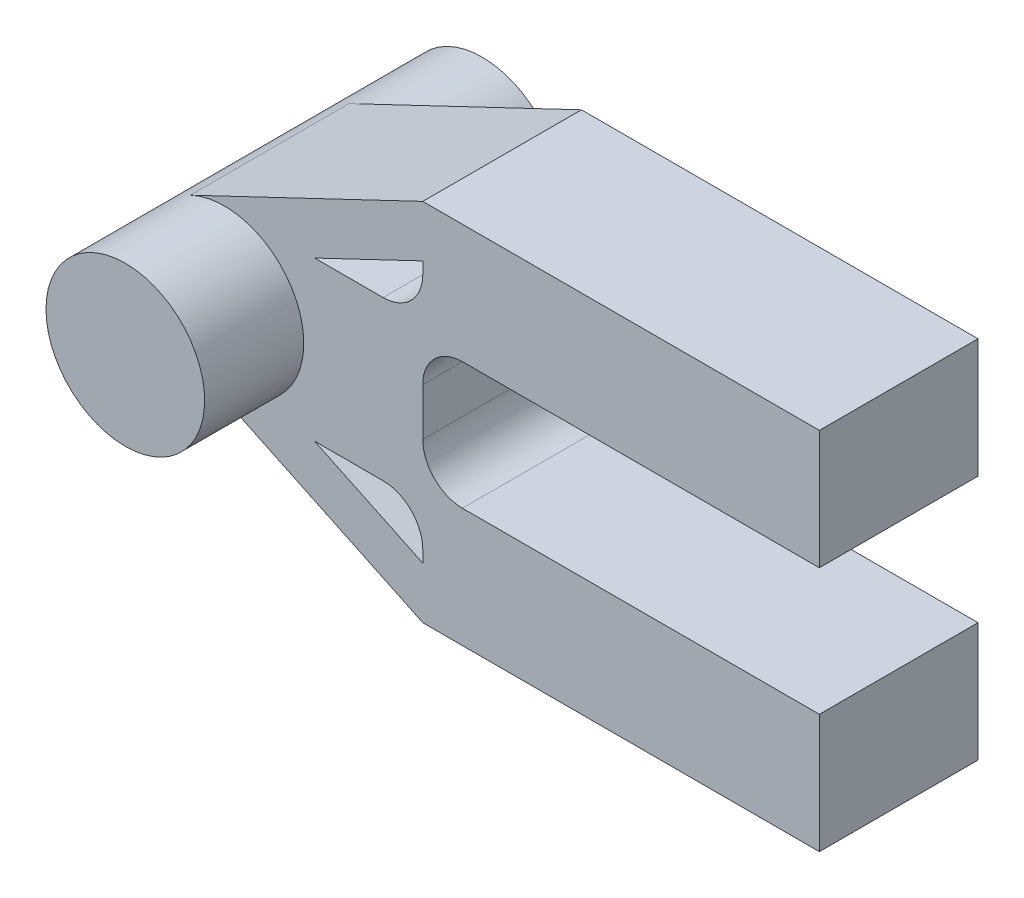
ISO-10303-21;
HEADER;
FILE_DESCRIPTION(('STEP AP214'),'2;1');
FILE_NAME('part.step','',(''),(''),'','','');
FILE_SCHEMA(('AUTOMOTIVE_DESIGN { 1 0 10303 214 1 1 1 1 }'));
ENDSEC;
DATA;
#1=APPLICATION_CONTEXT('core data for automotive mechanical design processes');
#2=APPLICATION_PROTOCOL_DEFINITION('international standard','automotive_design',2000,#1);
#3=PRODUCT_CONTEXT('',#1,'mechanical');
#4=PRODUCT('Part','Part','',(#3));
#5=PRODUCT_RELATED_PRODUCT_CATEGORY('part','',(#4));
#6=PRODUCT_DEFINITION_FORMATION('','',#4);
#7=PRODUCT_DEFINITION_CONTEXT('part definition',#1,'design');
#8=PRODUCT_DEFINITION('design','',#6,#7);
#9=PRODUCT_DEFINITION_SHAPE('','',#8);
#10=(LENGTH_UNIT() NAMED_UNIT(*) SI_UNIT(.MILLI.,.METRE.));
#11=(NAMED_UNIT(*) PLANE_ANGLE_UNIT() SI_UNIT($,.RADIAN.));
#12=(NAMED_UNIT(*) SI_UNIT($,.STERADIAN.) SOLID_ANGLE_UNIT());
#13=UNCERTAINTY_MEASURE_WITH_UNIT(LENGTH_MEASURE(1.E-05),#10,'distance_accuracy_value','');
#14=(GEOMETRIC_REPRESENTATION_CONTEXT(3) GLOBAL_UNCERTAINTY_ASSIGNED_CONTEXT((#13)) GLOBAL_UNIT_ASSIGNED_CONTEXT((#10,
#11,#12)) REPRESENTATION_CONTEXT('',''));
#15=CARTESIAN_POINT('',(0.,0.,0.));
#16=DIRECTION('',(0.,0.,1.));
#17=DIRECTION('',(1.,0.,0.));
#18=AXIS2_PLACEMENT_3D('',#15,#16,#17);
#19=CARTESIAN_POINT('',(0.,0.,0.));
#20=DIRECTION('',(0.,0.,1.));
#21=DIRECTION('',(1.,0.,0.));
#22=AXIS2_PLACEMENT_3D('',#19,#20,#21);
#23=PLANE('',#22);
#24=DIRECTION('',(0.90262924959913,0.4304189096312,0.));
#25=VECTOR('',#24,1.);
#26=CARTESIAN_POINT('',(18.6538539775263,18.0525849919826,0.));
#27=LINE('',#26,#25);
#28=CARTESIAN_POINT('',(22.7377678298497,20.,0.));
#29=VERTEX_POINT('',#28);
#30=CARTESIAN_POINT('',(50.,33.,0.));
#31=VERTEX_POINT('',#30);
#32=EDGE_CURVE('E205',#29,#31,#27,.T.);
#33=ORIENTED_EDGE('',*,*,#32,.F.);
#34=DIRECTION('',(-1.,0.,0.));
#35=VECTOR('',#34,1.);
#36=CARTESIAN_POINT('',(50.,20.,0.));
#37=LINE('',#36,#35);
#38=CARTESIAN_POINT('',(40.,20.,0.));
#39=VERTEX_POINT('',#38);
#40=EDGE_CURVE('E317',#39,#29,#37,.T.);
#41=ORIENTED_EDGE('',*,*,#40,.F.);
#42=CARTESIAN_POINT('',(40.,30.,0.));
#43=DIRECTION('',(0.,0.,1.));
#44=DIRECTION('',(1.,0.,0.));
#45=AXIS2_PLACEMENT_3D('',#42,#43,#44);
#46=CIRCLE('',#45,10.);
#47=CARTESIAN_POINT('',(50.,30.,0.));
#48=VERTEX_POINT('',#47);
#49=EDGE_CURVE('E11',#39,#48,#46,.T.);
#50=ORIENTED_EDGE('',*,*,#49,.T.);
#51=DIRECTION('',(0.,1.,0.));
#52=VECTOR('',#51,1.);
#53=CARTESIAN_POINT('',(50.,16.,0.));
#54=LINE('',#53,#52);
#55=EDGE_CURVE('E223',#48,#31,#54,.T.);
#56=ORIENTED_EDGE('',*,*,#55,.T.);
#57=EDGE_LOOP('',(#33,#41,#50,#56));
#58=FACE_BOUND('',#57,.T.);
#59=DIRECTION('',(0.,1.,0.));
#60=VECTOR('',#59,1.);
#61=CARTESIAN_POINT('',(50.,-46.,0.));
#62=LINE('',#61,#60);
#63=CARTESIAN_POINT('',(50.,-33.,0.));
#64=VERTEX_POINT('',#63);
#65=CARTESIAN_POINT('',(50.,-30.,0.));
#66=VERTEX_POINT('',#65);
#67=EDGE_CURVE('E255',#64,#66,#62,.T.);
#68=ORIENTED_EDGE('',*,*,#67,.T.);
#69=CARTESIAN_POINT('',(40.,-30.,0.));
#70=DIRECTION('',(0.,0.,1.));
#71=DIRECTION('',(1.,0.,0.));
#72=AXIS2_PLACEMENT_3D('',#69,#70,#71);
#73=CIRCLE('',#72,10.);
#74=CARTESIAN_POINT('',(40.,-20.,0.));
#75=VERTEX_POINT('',#74);
#76=EDGE_CURVE('E353',#66,#75,#73,.T.);
#77=ORIENTED_EDGE('',*,*,#76,.T.);
#78=DIRECTION('',(-1.,0.,0.));
#79=VECTOR('',#78,1.);
#80=CARTESIAN_POINT('',(50.,-20.,0.));
#81=LINE('',#80,#79);
#82=CARTESIAN_POINT('',(22.7377678298497,-20.,0.));
#83=VERTEX_POINT('',#82);
#84=EDGE_CURVE('E308',#75,#83,#81,.T.);
#85=ORIENTED_EDGE('',*,*,#84,.T.);
#86=DIRECTION('',(-0.90262924959913,0.4304189096312,0.));
#87=VECTOR('',#86,1.);
#88=CARTESIAN_POINT('',(18.6538539775263,-18.0525849919826,0.));
#89=LINE('',#88,#87);
#90=EDGE_CURVE('E385',#64,#83,#89,.T.);
#91=ORIENTED_EDGE('',*,*,#90,.F.);
#92=EDGE_LOOP('',(#68,#77,#85,#91));
#93=FACE_BOUND('',#92,.T.);
#94=CARTESIAN_POINT('',(0.,0.,0.));
#95=DIRECTION('',(0.,0.,-1.));
#96=DIRECTION('',(-1.,0.,0.));
#97=AXIS2_PLACEMENT_3D('',#94,#95,#96);
#98=CIRCLE('',#97,20.);
#99=CARTESIAN_POINT('',(-8.608378192624,18.0525849919826,0.));
#100=VERTEX_POINT('',#99);
#101=CARTESIAN_POINT('',(-8.60837819262399,-18.0525849919826,0.));
#102=VERTEX_POINT('',#101);
#103=EDGE_CURVE('E175',#100,#102,#98,.T.);
#104=ORIENTED_EDGE('',*,*,#103,.F.);
#105=DIRECTION('',(-0.90262924959913,-0.4304189096312,0.));
#106=VECTOR('',#105,1.);
#107=CARTESIAN_POINT('',(50.,46.,0.));
#108=LINE('',#107,#106);
#109=CARTESIAN_POINT('',(50.,46.,0.));
#110=VERTEX_POINT('',#109);
#111=EDGE_CURVE('E179',#110,#100,#108,.T.);
#112=ORIENTED_EDGE('',*,*,#111,.F.);
#113=DIRECTION('',(1.,0.,0.));
#114=VECTOR('',#113,1.);
#115=CARTESIAN_POINT('',(50.,46.,0.));
#116=LINE('',#115,#114);
#117=CARTESIAN_POINT('',(150.,46.,0.));
#118=VERTEX_POINT('',#117);
#119=EDGE_CURVE('E242',#110,#118,#116,.T.);
#120=ORIENTED_EDGE('',*,*,#119,.T.);
#121=DIRECTION('',(0.,-1.,0.));
#122=VECTOR('',#121,1.);
#123=CARTESIAN_POINT('',(150.,16.,0.));
#124=LINE('',#123,#122);
#125=CARTESIAN_POINT('',(150.,16.,0.));
#126=VERTEX_POINT('',#125);
#127=EDGE_CURVE('E245',#118,#126,#124,.T.);
#128=ORIENTED_EDGE('',*,*,#127,.T.);
#129=DIRECTION('',(-1.,0.,0.));
#130=VECTOR('',#129,1.);
#131=CARTESIAN_POINT('',(50.,16.,0.));
#132=LINE('',#131,#130);
#133=CARTESIAN_POINT('',(60.,16.,0.));
#134=VERTEX_POINT('',#133);
#135=EDGE_CURVE('E228',#126,#134,#132,.T.);
#136=ORIENTED_EDGE('',*,*,#135,.T.);
#137=CARTESIAN_POINT('',(60.,6.,0.));
#138=DIRECTION('',(0.,0.,1.));
#139=DIRECTION('',(1.,0.,0.));
#140=AXIS2_PLACEMENT_3D('',#137,#138,#139);
#141=CIRCLE('',#140,10.);
#142=CARTESIAN_POINT('',(50.,6.,0.));
#143=VERTEX_POINT('',#142);
#144=EDGE_CURVE('E365',#134,#143,#141,.T.);
#145=ORIENTED_EDGE('',*,*,#144,.T.);
#146=DIRECTION('',(0.,1.,0.));
#147=VECTOR('',#146,1.);
#148=CARTESIAN_POINT('',(50.,20.,0.));
#149=LINE('',#148,#147);
#150=CARTESIAN_POINT('',(50.,-5.99999999999999,0.));
#151=VERTEX_POINT('',#150);
#152=EDGE_CURVE('E294',#151,#143,#149,.T.);
#153=ORIENTED_EDGE('',*,*,#152,.F.);
#154=CARTESIAN_POINT('',(60.,-5.99999999999999,0.));
#155=DIRECTION('',(0.,0.,1.));
#156=DIRECTION('',(1.,0.,0.));
#157=AXIS2_PLACEMENT_3D('',#154,#155,#156);
#158=CIRCLE('',#157,10.);
#159=CARTESIAN_POINT('',(60.,-16.,0.));
#160=VERTEX_POINT('',#159);
#161=EDGE_CURVE('E359',#151,#160,#158,.T.);
#162=ORIENTED_EDGE('',*,*,#161,.T.);
#163=DIRECTION('',(1.,0.,0.));
#164=VECTOR('',#163,1.);
#165=CARTESIAN_POINT('',(50.,-16.,0.));
#166=LINE('',#165,#164);
#167=CARTESIAN_POINT('',(150.,-16.,0.));
#168=VERTEX_POINT('',#167);
#169=EDGE_CURVE('E281',#160,#168,#166,.T.);
#170=ORIENTED_EDGE('',*,*,#169,.T.);
#171=DIRECTION('',(0.,-1.,0.));
#172=VECTOR('',#171,1.);
#173=CARTESIAN_POINT('',(150.,-46.,0.));
#174=LINE('',#173,#172);
#175=CARTESIAN_POINT('',(150.,-46.,0.));
#176=VERTEX_POINT('',#175);
#177=EDGE_CURVE('E284',#168,#176,#174,.T.);
#178=ORIENTED_EDGE('',*,*,#177,.T.);
#179=DIRECTION('',(-1.,0.,0.));
#180=VECTOR('',#179,1.);
#181=CARTESIAN_POINT('',(50.,-46.,0.));
#182=LINE('',#181,#180);
#183=CARTESIAN_POINT('',(50.,-46.,0.));
#184=VERTEX_POINT('',#183);
#185=EDGE_CURVE('E266',#176,#184,#182,.T.);
#186=ORIENTED_EDGE('',*,*,#185,.T.);
#187=DIRECTION('',(0.90262924959913,-0.4304189096312,0.));
#188=VECTOR('',#187,1.);
#189=CARTESIAN_POINT('',(-8.60837819262399,-18.0525849919826,0.));
#190=LINE('',#189,#188);
#191=EDGE_CURVE('E181',#102,#184,#190,.T.);
#192=ORIENTED_EDGE('',*,*,#191,.F.);
#193=EDGE_LOOP('',(#104,#112,#120,#128,#136,#145,#153,#162,#170,#178,#186,#192));
#194=FACE_BOUND('',#193,.T.);
#195=ADVANCED_FACE('F39',(#58,#93,#194),#23,.F.);
#196=CARTESIAN_POINT('',(0.,0.,65.));
#197=DIRECTION('',(0.,0.,-1.));
#198=DIRECTION('',(-1.,0.,0.));
#199=AXIS2_PLACEMENT_3D('',#196,#197,#198);
#200=CYLINDRICAL_SURFACE('',#199,20.);
#201=CARTESIAN_POINT('',(0.,0.,65.));
#202=DIRECTION('',(0.,0.,1.));
#203=DIRECTION('',(1.,0.,0.));
#204=AXIS2_PLACEMENT_3D('',#201,#202,#203);
#205=CIRCLE('',#204,20.);
#206=CARTESIAN_POINT('',(20.,0.,65.));
#207=VERTEX_POINT('',#206);
#208=EDGE_CURVE('E320',#207,#207,#205,.T.);
#209=ORIENTED_EDGE('',*,*,#208,.F.);
#210=EDGE_LOOP('',(#209));
#211=FACE_BOUND('',#210,.T.);
#212=DIRECTION('',(0.,0.,-1.));
#213=VECTOR('',#212,1.);
#214=CARTESIAN_POINT('',(-8.60837819262399,-18.0525849919826,40.));
#215=LINE('',#214,#213);
#216=CARTESIAN_POINT('',(-8.60837819262399,-18.0525849919826,40.));
#217=VERTEX_POINT('',#216);
#218=EDGE_CURVE('E378',#217,#102,#215,.T.);
#219=ORIENTED_EDGE('',*,*,#218,.F.);
#220=CARTESIAN_POINT('',(0.,0.,40.));
#221=DIRECTION('',(0.,0.,-1.));
#222=DIRECTION('',(-1.,0.,0.));
#223=AXIS2_PLACEMENT_3D('',#220,#221,#222);
#224=CIRCLE('',#223,20.);
#225=CARTESIAN_POINT('',(-8.608378192624,18.0525849919826,40.));
#226=VERTEX_POINT('',#225);
#227=EDGE_CURVE('E192',#226,#217,#224,.T.);
#228=ORIENTED_EDGE('',*,*,#227,.F.);
#229=DIRECTION('',(0.,0.,-1.));
#230=VECTOR('',#229,1.);
#231=CARTESIAN_POINT('',(-8.60837819262401,18.0525849919826,40.));
#232=LINE('',#231,#230);
#233=EDGE_CURVE('E189',#226,#100,#232,.T.);
#234=ORIENTED_EDGE('',*,*,#233,.T.);
#235=ORIENTED_EDGE('',*,*,#103,.T.);
#236=EDGE_LOOP('',(#219,#228,#234,#235));
#237=FACE_BOUND('',#236,.T.);
#238=CARTESIAN_POINT('',(0.,0.,-25.));
#239=DIRECTION('',(0.,0.,-1.));
#240=DIRECTION('',(-1.,0.,0.));
#241=AXIS2_PLACEMENT_3D('',#238,#239,#240);
#242=CIRCLE('',#241,20.);
#243=CARTESIAN_POINT('',(-20.,0.,-25.));
#244=VERTEX_POINT('',#243);
#245=EDGE_CURVE('E186',#244,#244,#242,.T.);
#246=ORIENTED_EDGE('',*,*,#245,.F.);
#247=EDGE_LOOP('',(#246));
#248=FACE_BOUND('',#247,.T.);
#249=ADVANCED_FACE('F190',(#211,#237,#248),#200,.T.);
#250=CARTESIAN_POINT('',(50.,-20.,0.));
#251=DIRECTION('',(0.,1.,0.));
#252=DIRECTION('',(0.,0.,1.));
#253=AXIS2_PLACEMENT_3D('',#250,#251,#252);
#254=PLANE('',#253);
#255=ORIENTED_EDGE('',*,*,#84,.F.);
#256=DIRECTION('',(0.,0.,-1.));
#257=VECTOR('',#256,1.);
#258=CARTESIAN_POINT('',(40.,-20.,0.));
#259=LINE('',#258,#257);
#260=CARTESIAN_POINT('',(40.,-20.,40.));
#261=VERTEX_POINT('',#260);
#262=EDGE_CURVE('E330',#75,#261,#259,.F.);
#263=ORIENTED_EDGE('',*,*,#262,.T.);
#264=DIRECTION('',(-1.,0.,0.));
#265=VECTOR('',#264,1.);
#266=CARTESIAN_POINT('',(50.,-20.,40.));
#267=LINE('',#266,#265);
#268=CARTESIAN_POINT('',(22.7377678298498,-20.,40.));
#269=VERTEX_POINT('',#268);
#270=EDGE_CURVE('E311',#261,#269,#267,.T.);
#271=ORIENTED_EDGE('',*,*,#270,.T.);
#272=DIRECTION('',(0.,0.,1.));
#273=VECTOR('',#272,1.);
#274=CARTESIAN_POINT('',(22.7377678298497,-20.,0.));
#275=LINE('',#274,#273);
#276=EDGE_CURVE('E212',#83,#269,#275,.T.);
#277=ORIENTED_EDGE('',*,*,#276,.F.);
#278=EDGE_LOOP('',(#255,#263,#271,#277));
#279=FACE_BOUND('',#278,.T.);
#280=ADVANCED_FACE('F403',(#279),#254,.F.);
#281=CARTESIAN_POINT('',(50.,-46.,40.));
#282=DIRECTION('',(-1.,0.,0.));
#283=DIRECTION('',(0.,0.,1.));
#284=AXIS2_PLACEMENT_3D('',#281,#282,#283);
#285=PLANE('',#284);
#286=DIRECTION('',(0.,1.,0.));
#287=VECTOR('',#286,1.);
#288=CARTESIAN_POINT('',(50.,-46.,40.));
#289=LINE('',#288,#287);
#290=CARTESIAN_POINT('',(50.,-33.,40.));
#291=VERTEX_POINT('',#290);
#292=CARTESIAN_POINT('',(50.,-30.,40.));
#293=VERTEX_POINT('',#292);
#294=EDGE_CURVE('E261',#291,#293,#289,.T.);
#295=ORIENTED_EDGE('',*,*,#294,.T.);
#296=DIRECTION('',(0.,0.,-1.));
#297=VECTOR('',#296,1.);
#298=CARTESIAN_POINT('',(50.,-30.,40.));
#299=LINE('',#298,#297);
#300=EDGE_CURVE('E326',#293,#66,#299,.T.);
#301=ORIENTED_EDGE('',*,*,#300,.T.);
#302=ORIENTED_EDGE('',*,*,#67,.F.);
#303=DIRECTION('',(0.,0.,-1.));
#304=VECTOR('',#303,1.);
#305=CARTESIAN_POINT('',(50.,-33.,40.));
#306=LINE('',#305,#304);
#307=EDGE_CURVE('E381',#291,#64,#306,.T.);
#308=ORIENTED_EDGE('',*,*,#307,.F.);
#309=EDGE_LOOP('',(#295,#301,#302,#308));
#310=FACE_BOUND('',#309,.T.);
#311=ADVANCED_FACE('F410',(#310),#285,.T.);
#312=CARTESIAN_POINT('',(50.,20.,0.));
#313=DIRECTION('',(0.,-1.,0.));
#314=DIRECTION('',(0.,0.,-1.));
#315=AXIS2_PLACEMENT_3D('',#312,#313,#314);
#316=PLANE('',#315);
#317=DIRECTION('',(-1.,0.,0.));
#318=VECTOR('',#317,1.);
#319=CARTESIAN_POINT('',(50.,20.,40.));
#320=LINE('',#319,#318);
#321=CARTESIAN_POINT('',(40.,20.,40.));
#322=VERTEX_POINT('',#321);
#323=CARTESIAN_POINT('',(22.7377678298498,20.,40.));
#324=VERTEX_POINT('',#323);
#325=EDGE_CURVE('E314',#322,#324,#320,.T.);
#326=ORIENTED_EDGE('',*,*,#325,.F.);
#327=DIRECTION('',(0.,0.,1.));
#328=VECTOR('',#327,1.);
#329=CARTESIAN_POINT('',(40.,20.,0.));
#330=LINE('',#329,#328);
#331=EDGE_CURVE('E55',#322,#39,#330,.F.);
#332=ORIENTED_EDGE('',*,*,#331,.T.);
#333=ORIENTED_EDGE('',*,*,#40,.T.);
#334=DIRECTION('',(0.,0.,-1.));
#335=VECTOR('',#334,1.);
#336=CARTESIAN_POINT('',(22.7377678298497,20.,0.));
#337=LINE('',#336,#335);
#338=EDGE_CURVE('E219',#324,#29,#337,.T.);
#339=ORIENTED_EDGE('',*,*,#338,.F.);
#340=EDGE_LOOP('',(#326,#332,#333,#339));
#341=FACE_BOUND('',#340,.T.);
#342=ADVANCED_FACE('F497',(#341),#316,.F.);
#343=CARTESIAN_POINT('',(50.,16.,40.));
#344=DIRECTION('',(-1.,0.,0.));
#345=DIRECTION('',(0.,0.,1.));
#346=AXIS2_PLACEMENT_3D('',#343,#344,#345);
#347=PLANE('',#346);
#348=ORIENTED_EDGE('',*,*,#55,.F.);
#349=DIRECTION('',(0.,0.,1.));
#350=VECTOR('',#349,1.);
#351=CARTESIAN_POINT('',(50.,30.,40.));
#352=LINE('',#351,#350);
#353=CARTESIAN_POINT('',(50.,30.,40.));
#354=VERTEX_POINT('',#353);
#355=EDGE_CURVE('E347',#48,#354,#352,.T.);
#356=ORIENTED_EDGE('',*,*,#355,.T.);
#357=DIRECTION('',(0.,1.,0.));
#358=VECTOR('',#357,1.);
#359=CARTESIAN_POINT('',(50.,16.,40.));
#360=LINE('',#359,#358);
#361=CARTESIAN_POINT('',(50.,33.,40.));
#362=VERTEX_POINT('',#361);
#363=EDGE_CURVE('E224',#354,#362,#360,.T.);
#364=ORIENTED_EDGE('',*,*,#363,.T.);
#365=DIRECTION('',(0.,0.,-1.));
#366=VECTOR('',#365,1.);
#367=CARTESIAN_POINT('',(50.,33.,40.));
#368=LINE('',#367,#366);
#369=EDGE_CURVE('E197',#362,#31,#368,.T.);
#370=ORIENTED_EDGE('',*,*,#369,.T.);
#371=EDGE_LOOP('',(#348,#356,#364,#370));
#372=FACE_BOUND('',#371,.T.);
#373=ADVANCED_FACE('F493',(#372),#347,.T.);
#374=CARTESIAN_POINT('',(0.,0.,65.));
#375=DIRECTION('',(0.,0.,1.));
#376=DIRECTION('',(1.,0.,0.));
#377=AXIS2_PLACEMENT_3D('',#374,#375,#376);
#378=PLANE('',#377);
#379=ORIENTED_EDGE('',*,*,#208,.T.);
#380=EDGE_LOOP('',(#379));
#381=FACE_BOUND('',#380,.T.);
#382=ADVANCED_FACE('F496',(#381),#378,.T.);
#383=CARTESIAN_POINT('',(50.,20.,40.));
#384=DIRECTION('',(0.,0.,-1.));
#385=DIRECTION('',(-1.,0.,0.));
#386=AXIS2_PLACEMENT_3D('',#383,#384,#385);
#387=PLANE('',#386);
#388=ORIENTED_EDGE('',*,*,#227,.T.);
#389=DIRECTION('',(0.90262924959913,-0.4304189096312,0.));
#390=VECTOR('',#389,1.);
#391=CARTESIAN_POINT('',(-8.60837819262399,-18.0525849919826,40.));
#392=LINE('',#391,#390);
#393=CARTESIAN_POINT('',(50.,-46.,40.));
#394=VERTEX_POINT('',#393);
#395=EDGE_CURVE('E389',#217,#394,#392,.T.);
#396=ORIENTED_EDGE('',*,*,#395,.T.);
#397=DIRECTION('',(-1.,0.,0.));
#398=VECTOR('',#397,1.);
#399=CARTESIAN_POINT('',(50.,-46.,40.));
#400=LINE('',#399,#398);
#401=CARTESIAN_POINT('',(150.,-46.,40.));
#402=VERTEX_POINT('',#401);
#403=EDGE_CURVE('E273',#402,#394,#400,.T.);
#404=ORIENTED_EDGE('',*,*,#403,.F.);
#405=DIRECTION('',(0.,-1.,0.));
#406=VECTOR('',#405,1.);
#407=CARTESIAN_POINT('',(150.,-46.,40.));
#408=LINE('',#407,#406);
#409=CARTESIAN_POINT('',(150.,-16.,40.));
#410=VERTEX_POINT('',#409);
#411=EDGE_CURVE('E269',#410,#402,#408,.T.);
#412=ORIENTED_EDGE('',*,*,#411,.F.);
#413=DIRECTION('',(1.,0.,0.));
#414=VECTOR('',#413,1.);
#415=CARTESIAN_POINT('',(50.,-16.,40.));
#416=LINE('',#415,#414);
#417=CARTESIAN_POINT('',(60.,-16.,40.));
#418=VERTEX_POINT('',#417);
#419=EDGE_CURVE('E265',#418,#410,#416,.T.);
#420=ORIENTED_EDGE('',*,*,#419,.F.);
#421=CARTESIAN_POINT('',(60.,-5.99999999999999,40.));
#422=DIRECTION('',(0.,0.,-1.));
#423=DIRECTION('',(-1.,0.,0.));
#424=AXIS2_PLACEMENT_3D('',#421,#422,#423);
#425=CIRCLE('',#424,10.);
#426=CARTESIAN_POINT('',(50.,-5.99999999999999,40.));
#427=VERTEX_POINT('',#426);
#428=EDGE_CURVE('E362',#418,#427,#425,.T.);
#429=ORIENTED_EDGE('',*,*,#428,.T.);
#430=DIRECTION('',(0.,-1.,0.));
#431=VECTOR('',#430,1.);
#432=CARTESIAN_POINT('',(50.,20.,40.));
#433=LINE('',#432,#431);
#434=CARTESIAN_POINT('',(50.,6.,40.));
#435=VERTEX_POINT('',#434);
#436=EDGE_CURVE('E304',#435,#427,#433,.T.);
#437=ORIENTED_EDGE('',*,*,#436,.F.);
#438=CARTESIAN_POINT('',(60.,6.,40.));
#439=DIRECTION('',(0.,0.,-1.));
#440=DIRECTION('',(-1.,0.,0.));
#441=AXIS2_PLACEMENT_3D('',#438,#439,#440);
#442=CIRCLE('',#441,10.);
#443=CARTESIAN_POINT('',(60.,16.,40.));
#444=VERTEX_POINT('',#443);
#445=EDGE_CURVE('E368',#435,#444,#442,.T.);
#446=ORIENTED_EDGE('',*,*,#445,.T.);
#447=DIRECTION('',(-1.,0.,0.));
#448=VECTOR('',#447,1.);
#449=CARTESIAN_POINT('',(50.,16.,40.));
#450=LINE('',#449,#448);
#451=CARTESIAN_POINT('',(150.,16.,40.));
#452=VERTEX_POINT('',#451);
#453=EDGE_CURVE('E236',#452,#444,#450,.T.);
#454=ORIENTED_EDGE('',*,*,#453,.F.);
#455=DIRECTION('',(0.,-1.,0.));
#456=VECTOR('',#455,1.);
#457=CARTESIAN_POINT('',(150.,16.,40.));
#458=LINE('',#457,#456);
#459=CARTESIAN_POINT('',(150.,46.,40.));
#460=VERTEX_POINT('',#459);
#461=EDGE_CURVE('E232',#460,#452,#458,.T.);
#462=ORIENTED_EDGE('',*,*,#461,.F.);
#463=DIRECTION('',(1.,0.,0.));
#464=VECTOR('',#463,1.);
#465=CARTESIAN_POINT('',(50.,46.,40.));
#466=LINE('',#465,#464);
#467=CARTESIAN_POINT('',(50.,46.,40.));
#468=VERTEX_POINT('',#467);
#469=EDGE_CURVE('E227',#468,#460,#466,.T.);
#470=ORIENTED_EDGE('',*,*,#469,.F.);
#471=DIRECTION('',(-0.90262924959913,-0.4304189096312,0.));
#472=VECTOR('',#471,1.);
#473=CARTESIAN_POINT('',(50.,46.,40.));
#474=LINE('',#473,#472);
#475=EDGE_CURVE('E198',#468,#226,#474,.T.);
#476=ORIENTED_EDGE('',*,*,#475,.T.);
#477=EDGE_LOOP('',(#388,#396,#404,#412,#420,#429,#437,#446,#454,#462,#470,#476));
#478=FACE_BOUND('',#477,.T.);
#479=DIRECTION('',(-0.90262924959913,0.4304189096312,0.));
#480=VECTOR('',#479,1.);
#481=CARTESIAN_POINT('',(18.6538539775263,-18.0525849919826,40.));
#482=LINE('',#481,#480);
#483=EDGE_CURVE('E384',#291,#269,#482,.T.);
#484=ORIENTED_EDGE('',*,*,#483,.T.);
#485=ORIENTED_EDGE('',*,*,#270,.F.);
#486=CARTESIAN_POINT('',(40.,-30.,40.));
#487=DIRECTION('',(0.,0.,-1.));
#488=DIRECTION('',(-1.,0.,0.));
#489=AXIS2_PLACEMENT_3D('',#486,#487,#488);
#490=CIRCLE('',#489,10.);
#491=EDGE_CURVE('E356',#261,#293,#490,.T.);
#492=ORIENTED_EDGE('',*,*,#491,.T.);
#493=ORIENTED_EDGE('',*,*,#294,.F.);
#494=EDGE_LOOP('',(#484,#485,#492,#493));
#495=FACE_BOUND('',#494,.T.);
#496=ORIENTED_EDGE('',*,*,#363,.F.);
#497=CARTESIAN_POINT('',(40.,30.,40.));
#498=DIRECTION('',(0.,0.,-1.));
#499=DIRECTION('',(-1.,0.,0.));
#500=AXIS2_PLACEMENT_3D('',#497,#498,#499);
#501=CIRCLE('',#500,10.);
#502=EDGE_CURVE('E48',#354,#322,#501,.T.);
#503=ORIENTED_EDGE('',*,*,#502,.T.);
#504=ORIENTED_EDGE('',*,*,#325,.T.);
#505=DIRECTION('',(0.90262924959913,0.4304189096312,0.));
#506=VECTOR('',#505,1.);
#507=CARTESIAN_POINT('',(18.6538539775263,18.0525849919826,40.));
#508=LINE('',#507,#506);
#509=EDGE_CURVE('E204',#324,#362,#508,.T.);
#510=ORIENTED_EDGE('',*,*,#509,.T.);
#511=EDGE_LOOP('',(#496,#503,#504,#510));
#512=FACE_BOUND('',#511,.T.);
#513=ADVANCED_FACE('F438',(#478,#495,#512),#387,.F.);
#514=CARTESIAN_POINT('',(50.,0.,0.));
#515=DIRECTION('',(-1.,0.,0.));
#516=DIRECTION('',(0.,0.,1.));
#517=AXIS2_PLACEMENT_3D('',#514,#515,#516);
#518=PLANE('',#517);
#519=ORIENTED_EDGE('',*,*,#436,.T.);
#520=DIRECTION('',(0.,0.,-1.));
#521=VECTOR('',#520,1.);
#522=CARTESIAN_POINT('',(50.,-5.99999999999999,0.));
#523=LINE('',#522,#521);
#524=EDGE_CURVE('E336',#427,#151,#523,.T.);
#525=ORIENTED_EDGE('',*,*,#524,.T.);
#526=ORIENTED_EDGE('',*,*,#152,.T.);
#527=DIRECTION('',(0.,0.,-1.));
#528=VECTOR('',#527,1.);
#529=CARTESIAN_POINT('',(50.,6.,0.));
#530=LINE('',#529,#528);
#531=EDGE_CURVE('E333',#143,#435,#530,.F.);
#532=ORIENTED_EDGE('',*,*,#531,.T.);
#533=EDGE_LOOP('',(#519,#525,#526,#532));
#534=FACE_BOUND('',#533,.T.);
#535=ADVANCED_FACE('F451',(#534),#518,.F.);
#536=CARTESIAN_POINT('',(50.,-46.,40.));
#537=DIRECTION('',(0.,-1.,0.));
#538=DIRECTION('',(1.,0.,0.));
#539=AXIS2_PLACEMENT_3D('',#536,#537,#538);
#540=PLANE('',#539);
#541=ORIENTED_EDGE('',*,*,#185,.F.);
#542=DIRECTION('',(0.,0.,-1.));
#543=VECTOR('',#542,1.);
#544=CARTESIAN_POINT('',(150.,-46.,40.));
#545=LINE('',#544,#543);
#546=EDGE_CURVE('E295',#402,#176,#545,.T.);
#547=ORIENTED_EDGE('',*,*,#546,.F.);
#548=ORIENTED_EDGE('',*,*,#403,.T.);
#549=DIRECTION('',(0.,0.,-1.));
#550=VECTOR('',#549,1.);
#551=CARTESIAN_POINT('',(50.,-46.,40.));
#552=LINE('',#551,#550);
#553=EDGE_CURVE('E290',#394,#184,#552,.T.);
#554=ORIENTED_EDGE('',*,*,#553,.T.);
#555=EDGE_LOOP('',(#541,#547,#548,#554));
#556=FACE_BOUND('',#555,.T.);
#557=ADVANCED_FACE('F466',(#556),#540,.T.);
#558=CARTESIAN_POINT('',(150.,-46.,40.));
#559=DIRECTION('',(1.,0.,0.));
#560=DIRECTION('',(0.,0.,-1.));
#561=AXIS2_PLACEMENT_3D('',#558,#559,#560);
#562=PLANE('',#561);
#563=ORIENTED_EDGE('',*,*,#177,.F.);
#564=DIRECTION('',(0.,0.,-1.));
#565=VECTOR('',#564,1.);
#566=CARTESIAN_POINT('',(150.,-16.,40.));
#567=LINE('',#566,#565);
#568=EDGE_CURVE('E277',#410,#168,#567,.T.);
#569=ORIENTED_EDGE('',*,*,#568,.F.);
#570=ORIENTED_EDGE('',*,*,#411,.T.);
#571=ORIENTED_EDGE('',*,*,#546,.T.);
#572=EDGE_LOOP('',(#563,#569,#570,#571));
#573=FACE_BOUND('',#572,.T.);
#574=ADVANCED_FACE('F463',(#573),#562,.T.);
#575=CARTESIAN_POINT('',(50.,-16.,40.));
#576=DIRECTION('',(0.,1.,0.));
#577=DIRECTION('',(-1.,0.,0.));
#578=AXIS2_PLACEMENT_3D('',#575,#576,#577);
#579=PLANE('',#578);
#580=ORIENTED_EDGE('',*,*,#169,.F.);
#581=DIRECTION('',(0.,0.,-1.));
#582=VECTOR('',#581,1.);
#583=CARTESIAN_POINT('',(60.,-16.,40.));
#584=LINE('',#583,#582);
#585=EDGE_CURVE('E340',#160,#418,#584,.F.);
#586=ORIENTED_EDGE('',*,*,#585,.T.);
#587=ORIENTED_EDGE('',*,*,#419,.T.);
#588=ORIENTED_EDGE('',*,*,#568,.T.);
#589=EDGE_LOOP('',(#580,#586,#587,#588));
#590=FACE_BOUND('',#589,.T.);
#591=ADVANCED_FACE('F457',(#590),#579,.T.);
#592=CARTESIAN_POINT('',(50.,16.,40.));
#593=DIRECTION('',(0.,-1.,0.));
#594=DIRECTION('',(1.,0.,0.));
#595=AXIS2_PLACEMENT_3D('',#592,#593,#594);
#596=PLANE('',#595);
#597=ORIENTED_EDGE('',*,*,#453,.T.);
#598=DIRECTION('',(0.,0.,-1.));
#599=VECTOR('',#598,1.);
#600=CARTESIAN_POINT('',(60.,16.,40.));
#601=LINE('',#600,#599);
#602=EDGE_CURVE('E343',#444,#134,#601,.T.);
#603=ORIENTED_EDGE('',*,*,#602,.T.);
#604=ORIENTED_EDGE('',*,*,#135,.F.);
#605=DIRECTION('',(0.,0.,-1.));
#606=VECTOR('',#605,1.);
#607=CARTESIAN_POINT('',(150.,16.,40.));
#608=LINE('',#607,#606);
#609=EDGE_CURVE('E252',#452,#126,#608,.T.);
#610=ORIENTED_EDGE('',*,*,#609,.F.);
#611=EDGE_LOOP('',(#597,#603,#604,#610));
#612=FACE_BOUND('',#611,.T.);
#613=ADVANCED_FACE('F442',(#612),#596,.T.);
#614=CARTESIAN_POINT('',(150.,16.,40.));
#615=DIRECTION('',(1.,0.,0.));
#616=DIRECTION('',(0.,0.,-1.));
#617=AXIS2_PLACEMENT_3D('',#614,#615,#616);
#618=PLANE('',#617);
#619=ORIENTED_EDGE('',*,*,#127,.F.);
#620=DIRECTION('',(0.,0.,-1.));
#621=VECTOR('',#620,1.);
#622=CARTESIAN_POINT('',(150.,46.,40.));
#623=LINE('',#622,#621);
#624=EDGE_CURVE('E256',#460,#118,#623,.T.);
#625=ORIENTED_EDGE('',*,*,#624,.F.);
#626=ORIENTED_EDGE('',*,*,#461,.T.);
#627=ORIENTED_EDGE('',*,*,#609,.T.);
#628=EDGE_LOOP('',(#619,#625,#626,#627));
#629=FACE_BOUND('',#628,.T.);
#630=ADVANCED_FACE('F446',(#629),#618,.T.);
#631=CARTESIAN_POINT('',(50.,46.,40.));
#632=DIRECTION('',(0.,1.,0.));
#633=DIRECTION('',(-1.,0.,0.));
#634=AXIS2_PLACEMENT_3D('',#631,#632,#633);
#635=PLANE('',#634);
#636=ORIENTED_EDGE('',*,*,#119,.F.);
#637=DIRECTION('',(0.,0.,-1.));
#638=VECTOR('',#637,1.);
#639=CARTESIAN_POINT('',(50.,46.,40.));
#640=LINE('',#639,#638);
#641=EDGE_CURVE('E202',#468,#110,#640,.T.);
#642=ORIENTED_EDGE('',*,*,#641,.F.);
#643=ORIENTED_EDGE('',*,*,#469,.T.);
#644=ORIENTED_EDGE('',*,*,#624,.T.);
#645=EDGE_LOOP('',(#636,#642,#643,#644));
#646=FACE_BOUND('',#645,.T.);
#647=ADVANCED_FACE('F448',(#646),#635,.T.);
#648=CARTESIAN_POINT('',(18.6538539775263,18.0525849919826,40.));
#649=DIRECTION('',(-0.4304189096312,0.90262924959913,0.));
#650=DIRECTION('',(-0.90262924959913,-0.4304189096312,0.));
#651=AXIS2_PLACEMENT_3D('',#648,#649,#650);
#652=PLANE('',#651);
#653=ORIENTED_EDGE('',*,*,#509,.F.);
#654=ORIENTED_EDGE('',*,*,#338,.T.);
#655=ORIENTED_EDGE('',*,*,#32,.T.);
#656=ORIENTED_EDGE('',*,*,#369,.F.);
#657=EDGE_LOOP('',(#653,#654,#655,#656));
#658=FACE_BOUND('',#657,.T.);
#659=ADVANCED_FACE('F483',(#658),#652,.F.);
#660=CARTESIAN_POINT('',(50.,46.,40.));
#661=DIRECTION('',(0.4304189096312,-0.90262924959913,0.));
#662=DIRECTION('',(0.90262924959913,0.4304189096312,0.));
#663=AXIS2_PLACEMENT_3D('',#660,#661,#662);
#664=PLANE('',#663);
#665=ORIENTED_EDGE('',*,*,#111,.T.);
#666=ORIENTED_EDGE('',*,*,#233,.F.);
#667=ORIENTED_EDGE('',*,*,#475,.F.);
#668=ORIENTED_EDGE('',*,*,#641,.T.);
#669=EDGE_LOOP('',(#665,#666,#667,#668));
#670=FACE_BOUND('',#669,.T.);
#671=ADVANCED_FACE('F201',(#670),#664,.F.);
#672=CARTESIAN_POINT('',(18.6538539775263,-18.0525849919826,40.));
#673=DIRECTION('',(-0.4304189096312,-0.90262924959913,0.));
#674=DIRECTION('',(0.90262924959913,-0.4304189096312,0.));
#675=AXIS2_PLACEMENT_3D('',#672,#673,#674);
#676=PLANE('',#675);
#677=ORIENTED_EDGE('',*,*,#90,.T.);
#678=ORIENTED_EDGE('',*,*,#276,.T.);
#679=ORIENTED_EDGE('',*,*,#483,.F.);
#680=ORIENTED_EDGE('',*,*,#307,.T.);
#681=EDGE_LOOP('',(#677,#678,#679,#680));
#682=FACE_BOUND('',#681,.T.);
#683=ADVANCED_FACE('F472',(#682),#676,.F.);
#684=CARTESIAN_POINT('',(-8.60837819262399,-18.0525849919826,40.));
#685=DIRECTION('',(0.4304189096312,0.90262924959913,0.));
#686=DIRECTION('',(-0.90262924959913,0.4304189096312,0.));
#687=AXIS2_PLACEMENT_3D('',#684,#685,#686);
#688=PLANE('',#687);
#689=ORIENTED_EDGE('',*,*,#191,.T.);
#690=ORIENTED_EDGE('',*,*,#553,.F.);
#691=ORIENTED_EDGE('',*,*,#395,.F.);
#692=ORIENTED_EDGE('',*,*,#218,.T.);
#693=EDGE_LOOP('',(#689,#690,#691,#692));
#694=FACE_BOUND('',#693,.T.);
#695=ADVANCED_FACE('F422',(#694),#688,.F.);
#696=CARTESIAN_POINT('',(40.,-30.,40.));
#697=DIRECTION('',(0.,0.,-1.));
#698=DIRECTION('',(0.,1.,0.));
#699=AXIS2_PLACEMENT_3D('',#696,#697,#698);
#700=CYLINDRICAL_SURFACE('',#699,10.);
#701=ORIENTED_EDGE('',*,*,#491,.F.);
#702=ORIENTED_EDGE('',*,*,#262,.F.);
#703=ORIENTED_EDGE('',*,*,#76,.F.);
#704=ORIENTED_EDGE('',*,*,#300,.F.);
#705=EDGE_LOOP('',(#701,#702,#703,#704));
#706=FACE_BOUND('',#705,.T.);
#707=ADVANCED_FACE('F418',(#706),#700,.F.);
#708=CARTESIAN_POINT('',(60.,-5.99999999999999,0.));
#709=DIRECTION('',(0.,0.,-1.));
#710=DIRECTION('',(-1.,0.,0.));
#711=AXIS2_PLACEMENT_3D('',#708,#709,#710);
#712=CYLINDRICAL_SURFACE('',#711,10.);
#713=ORIENTED_EDGE('',*,*,#428,.F.);
#714=ORIENTED_EDGE('',*,*,#585,.F.);
#715=ORIENTED_EDGE('',*,*,#161,.F.);
#716=ORIENTED_EDGE('',*,*,#524,.F.);
#717=EDGE_LOOP('',(#713,#714,#715,#716));
#718=FACE_BOUND('',#717,.T.);
#719=ADVANCED_FACE('F421',(#718),#712,.F.);
#720=CARTESIAN_POINT('',(60.,6.,40.));
#721=DIRECTION('',(0.,0.,-1.));
#722=DIRECTION('',(-1.,0.,0.));
#723=AXIS2_PLACEMENT_3D('',#720,#721,#722);
#724=CYLINDRICAL_SURFACE('',#723,10.);
#725=ORIENTED_EDGE('',*,*,#445,.F.);
#726=ORIENTED_EDGE('',*,*,#531,.F.);
#727=ORIENTED_EDGE('',*,*,#144,.F.);
#728=ORIENTED_EDGE('',*,*,#602,.F.);
#729=EDGE_LOOP('',(#725,#726,#727,#728));
#730=FACE_BOUND('',#729,.T.);
#731=ADVANCED_FACE('F425',(#730),#724,.F.);
#732=CARTESIAN_POINT('',(40.,30.,40.));
#733=DIRECTION('',(0.,0.,1.));
#734=DIRECTION('',(0.,-1.,0.));
#735=AXIS2_PLACEMENT_3D('',#732,#733,#734);
#736=CYLINDRICAL_SURFACE('',#735,10.);
#737=ORIENTED_EDGE('',*,*,#49,.F.);
#738=ORIENTED_EDGE('',*,*,#331,.F.);
#739=ORIENTED_EDGE('',*,*,#502,.F.);
#740=ORIENTED_EDGE('',*,*,#355,.F.);
#741=EDGE_LOOP('',(#737,#738,#739,#740));
#742=FACE_BOUND('',#741,.T.);
#743=ADVANCED_FACE('F41',(#742),#736,.F.);
#744=CARTESIAN_POINT('',(0.,0.,-25.));
#745=DIRECTION('',(0.,0.,-1.));
#746=DIRECTION('',(-1.,0.,0.));
#747=AXIS2_PLACEMENT_3D('',#744,#745,#746);
#748=PLANE('',#747);
#749=ORIENTED_EDGE('',*,*,#245,.T.);
#750=EDGE_LOOP('',(#749));
#751=FACE_BOUND('',#750,.T.);
#752=ADVANCED_FACE('F401',(#751),#748,.T.);
#753=CLOSED_SHELL('',(#195,#249,#280,#311,#342,#373,#382,#513,#535,#557,#574,#591,#613,#630,
#647,#659,#671,#683,#695,#707,#719,#731,#743,#752));
#754=MANIFOLD_SOLID_BREP('B2',#753);
#755=ADVANCED_BREP_SHAPE_REPRESENTATION('',(#18,#754),#14);
#756=SHAPE_DEFINITION_REPRESENTATION(#9,#755);
ENDSEC;
END-ISO-10303-21;
